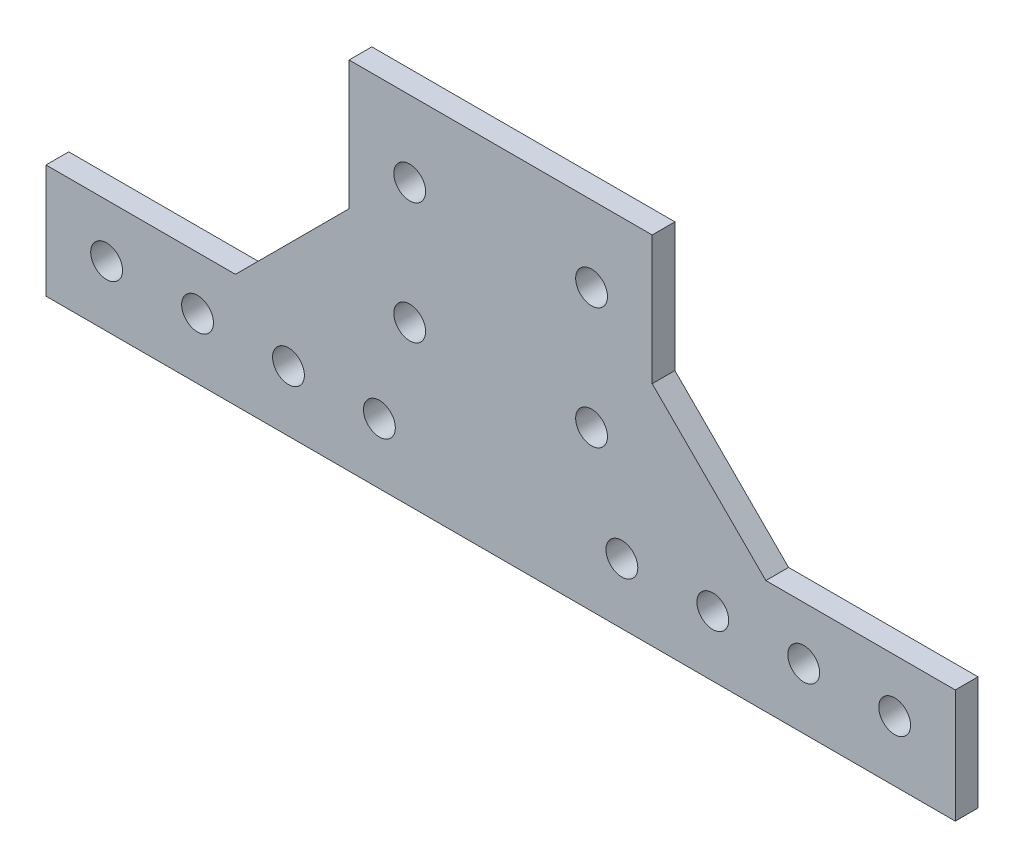
ISO-10303-21;
HEADER;
FILE_DESCRIPTION(('STEP AP214'),'2;1');
FILE_NAME('part.step','',(''),(''),'','','');
FILE_SCHEMA(('AUTOMOTIVE_DESIGN { 1 0 10303 214 1 1 1 1 }'));
ENDSEC;
DATA;
#1=APPLICATION_CONTEXT('core data for automotive mechanical design processes');
#2=APPLICATION_PROTOCOL_DEFINITION('international standard','automotive_design',2000,#1);
#3=PRODUCT_CONTEXT('',#1,'mechanical');
#4=PRODUCT('Part','Part','',(#3));
#5=PRODUCT_RELATED_PRODUCT_CATEGORY('part','',(#4));
#6=PRODUCT_DEFINITION_FORMATION('','',#4);
#7=PRODUCT_DEFINITION_CONTEXT('part definition',#1,'design');
#8=PRODUCT_DEFINITION('design','',#6,#7);
#9=PRODUCT_DEFINITION_SHAPE('','',#8);
#10=(LENGTH_UNIT() NAMED_UNIT(*) SI_UNIT(.MILLI.,.METRE.));
#11=(NAMED_UNIT(*) PLANE_ANGLE_UNIT() SI_UNIT($,.RADIAN.));
#12=(NAMED_UNIT(*) SI_UNIT($,.STERADIAN.) SOLID_ANGLE_UNIT());
#13=UNCERTAINTY_MEASURE_WITH_UNIT(LENGTH_MEASURE(1.E-05),#10,'distance_accuracy_value','');
#14=(GEOMETRIC_REPRESENTATION_CONTEXT(3) GLOBAL_UNCERTAINTY_ASSIGNED_CONTEXT((#13)) GLOBAL_UNIT_ASSIGNED_CONTEXT((#10,
#11,#12)) REPRESENTATION_CONTEXT('',''));
#15=CARTESIAN_POINT('',(0.,0.,0.));
#16=DIRECTION('',(0.,0.,1.));
#17=DIRECTION('',(1.,0.,0.));
#18=AXIS2_PLACEMENT_3D('',#15,#16,#17);
#19=CARTESIAN_POINT('',(120.,0.,3.));
#20=DIRECTION('',(0.,1.,0.));
#21=DIRECTION('',(-1.,0.,0.));
#22=AXIS2_PLACEMENT_3D('',#19,#20,#21);
#23=PLANE('',#22);
#24=DIRECTION('',(1.,0.,0.));
#25=VECTOR('',#24,1.);
#26=CARTESIAN_POINT('',(120.,0.,0.));
#27=LINE('',#26,#25);
#28=CARTESIAN_POINT('',(0.,0.,0.));
#29=VERTEX_POINT('',#28);
#30=CARTESIAN_POINT('',(120.,0.,0.));
#31=VERTEX_POINT('',#30);
#32=EDGE_CURVE('E143',#29,#31,#27,.T.);
#33=ORIENTED_EDGE('',*,*,#32,.T.);
#34=DIRECTION('',(0.,0.,-1.));
#35=VECTOR('',#34,1.);
#36=CARTESIAN_POINT('',(120.,0.,3.));
#37=LINE('',#36,#35);
#38=CARTESIAN_POINT('',(120.,0.,3.));
#39=VERTEX_POINT('',#38);
#40=EDGE_CURVE('E11',#39,#31,#37,.T.);
#41=ORIENTED_EDGE('',*,*,#40,.F.);
#42=DIRECTION('',(1.,0.,0.));
#43=VECTOR('',#42,1.);
#44=CARTESIAN_POINT('',(120.,0.,3.));
#45=LINE('',#44,#43);
#46=CARTESIAN_POINT('',(0.,0.,3.));
#47=VERTEX_POINT('',#46);
#48=EDGE_CURVE('E162',#47,#39,#45,.T.);
#49=ORIENTED_EDGE('',*,*,#48,.F.);
#50=DIRECTION('',(0.,0.,-1.));
#51=VECTOR('',#50,1.);
#52=CARTESIAN_POINT('',(0.,0.,3.));
#53=LINE('',#52,#51);
#54=EDGE_CURVE('E139',#47,#29,#53,.T.);
#55=ORIENTED_EDGE('',*,*,#54,.T.);
#56=EDGE_LOOP('',(#33,#41,#49,#55));
#57=FACE_BOUND('',#56,.T.);
#58=ADVANCED_FACE('F35',(#57),#23,.F.);
#59=CARTESIAN_POINT('',(120.,15.,3.));
#60=DIRECTION('',(-1.,0.,0.));
#61=DIRECTION('',(0.,-1.,0.));
#62=AXIS2_PLACEMENT_3D('',#59,#60,#61);
#63=PLANE('',#62);
#64=DIRECTION('',(0.,1.,0.));
#65=VECTOR('',#64,1.);
#66=CARTESIAN_POINT('',(120.,15.,0.));
#67=LINE('',#66,#65);
#68=CARTESIAN_POINT('',(120.,15.,0.));
#69=VERTEX_POINT('',#68);
#70=EDGE_CURVE('E146',#31,#69,#67,.T.);
#71=ORIENTED_EDGE('',*,*,#70,.T.);
#72=DIRECTION('',(0.,0.,-1.));
#73=VECTOR('',#72,1.);
#74=CARTESIAN_POINT('',(120.,15.,3.));
#75=LINE('',#74,#73);
#76=CARTESIAN_POINT('',(120.,15.,3.));
#77=VERTEX_POINT('',#76);
#78=EDGE_CURVE('E43',#77,#69,#75,.T.);
#79=ORIENTED_EDGE('',*,*,#78,.F.);
#80=DIRECTION('',(0.,1.,0.));
#81=VECTOR('',#80,1.);
#82=CARTESIAN_POINT('',(120.,15.,3.));
#83=LINE('',#82,#81);
#84=EDGE_CURVE('E100',#39,#77,#83,.T.);
#85=ORIENTED_EDGE('',*,*,#84,.F.);
#86=ORIENTED_EDGE('',*,*,#40,.T.);
#87=EDGE_LOOP('',(#71,#79,#85,#86));
#88=FACE_BOUND('',#87,.T.);
#89=ADVANCED_FACE('F331',(#88),#63,.F.);
#90=CARTESIAN_POINT('',(95.0000000000001,15.,3.));
#91=DIRECTION('',(0.,-1.,0.));
#92=DIRECTION('',(0.,0.,-1.));
#93=AXIS2_PLACEMENT_3D('',#90,#91,#92);
#94=PLANE('',#93);
#95=DIRECTION('',(-1.,0.,0.));
#96=VECTOR('',#95,1.);
#97=CARTESIAN_POINT('',(95.0000000000001,15.,0.));
#98=LINE('',#97,#96);
#99=CARTESIAN_POINT('',(95.0000000000001,15.,0.));
#100=VERTEX_POINT('',#99);
#101=EDGE_CURVE('E149',#69,#100,#98,.T.);
#102=ORIENTED_EDGE('',*,*,#101,.T.);
#103=DIRECTION('',(0.,0.,-1.));
#104=VECTOR('',#103,1.);
#105=CARTESIAN_POINT('',(95.0000000000001,15.,3.));
#106=LINE('',#105,#104);
#107=CARTESIAN_POINT('',(95.0000000000001,15.,3.));
#108=VERTEX_POINT('',#107);
#109=EDGE_CURVE('E175',#108,#100,#106,.T.);
#110=ORIENTED_EDGE('',*,*,#109,.F.);
#111=DIRECTION('',(-1.,0.,0.));
#112=VECTOR('',#111,1.);
#113=CARTESIAN_POINT('',(95.0000000000001,15.,3.));
#114=LINE('',#113,#112);
#115=EDGE_CURVE('E183',#77,#108,#114,.T.);
#116=ORIENTED_EDGE('',*,*,#115,.F.);
#117=ORIENTED_EDGE('',*,*,#78,.T.);
#118=EDGE_LOOP('',(#102,#110,#116,#117));
#119=FACE_BOUND('',#118,.T.);
#120=ADVANCED_FACE('F181',(#119),#94,.F.);
#121=CARTESIAN_POINT('',(80.,30.,3.));
#122=DIRECTION('',(-0.707106781186548,-0.707106781186547,0.));
#123=DIRECTION('',(0.707106781186547,-0.707106781186548,0.));
#124=AXIS2_PLACEMENT_3D('',#121,#122,#123);
#125=PLANE('',#124);
#126=DIRECTION('',(-0.707106781186547,0.707106781186548,0.));
#127=VECTOR('',#126,1.);
#128=CARTESIAN_POINT('',(80.,30.,0.));
#129=LINE('',#128,#127);
#130=CARTESIAN_POINT('',(80.,30.,0.));
#131=VERTEX_POINT('',#130);
#132=EDGE_CURVE('E151',#100,#131,#129,.T.);
#133=ORIENTED_EDGE('',*,*,#132,.T.);
#134=DIRECTION('',(0.,0.,-1.));
#135=VECTOR('',#134,1.);
#136=CARTESIAN_POINT('',(80.,30.,3.));
#137=LINE('',#136,#135);
#138=CARTESIAN_POINT('',(80.,30.,3.));
#139=VERTEX_POINT('',#138);
#140=EDGE_CURVE('E172',#139,#131,#137,.T.);
#141=ORIENTED_EDGE('',*,*,#140,.F.);
#142=DIRECTION('',(-0.707106781186547,0.707106781186548,0.));
#143=VECTOR('',#142,1.);
#144=CARTESIAN_POINT('',(80.,30.,3.));
#145=LINE('',#144,#143);
#146=EDGE_CURVE('E201',#108,#139,#145,.T.);
#147=ORIENTED_EDGE('',*,*,#146,.F.);
#148=ORIENTED_EDGE('',*,*,#109,.T.);
#149=EDGE_LOOP('',(#133,#141,#147,#148));
#150=FACE_BOUND('',#149,.T.);
#151=ADVANCED_FACE('F192',(#150),#125,.F.);
#152=CARTESIAN_POINT('',(80.,47.,3.));
#153=DIRECTION('',(-1.,0.,0.));
#154=DIRECTION('',(0.,0.,1.));
#155=AXIS2_PLACEMENT_3D('',#152,#153,#154);
#156=PLANE('',#155);
#157=DIRECTION('',(0.,1.,0.));
#158=VECTOR('',#157,1.);
#159=CARTESIAN_POINT('',(80.,47.,0.));
#160=LINE('',#159,#158);
#161=CARTESIAN_POINT('',(80.,47.,0.));
#162=VERTEX_POINT('',#161);
#163=EDGE_CURVE('E153',#131,#162,#160,.T.);
#164=ORIENTED_EDGE('',*,*,#163,.T.);
#165=DIRECTION('',(0.,0.,-1.));
#166=VECTOR('',#165,1.);
#167=CARTESIAN_POINT('',(80.,47.,3.));
#168=LINE('',#167,#166);
#169=CARTESIAN_POINT('',(80.,47.,3.));
#170=VERTEX_POINT('',#169);
#171=EDGE_CURVE('E169',#170,#162,#168,.T.);
#172=ORIENTED_EDGE('',*,*,#171,.F.);
#173=DIRECTION('',(0.,1.,0.));
#174=VECTOR('',#173,1.);
#175=CARTESIAN_POINT('',(80.,47.,3.));
#176=LINE('',#175,#174);
#177=EDGE_CURVE('E198',#139,#170,#176,.T.);
#178=ORIENTED_EDGE('',*,*,#177,.F.);
#179=ORIENTED_EDGE('',*,*,#140,.T.);
#180=EDGE_LOOP('',(#164,#172,#178,#179));
#181=FACE_BOUND('',#180,.T.);
#182=ADVANCED_FACE('F196',(#181),#156,.F.);
#183=CARTESIAN_POINT('',(40.,47.,3.));
#184=DIRECTION('',(0.,-1.,0.));
#185=DIRECTION('',(0.,0.,-1.));
#186=AXIS2_PLACEMENT_3D('',#183,#184,#185);
#187=PLANE('',#186);
#188=DIRECTION('',(-1.,0.,0.));
#189=VECTOR('',#188,1.);
#190=CARTESIAN_POINT('',(40.,47.,0.));
#191=LINE('',#190,#189);
#192=CARTESIAN_POINT('',(40.,47.,0.));
#193=VERTEX_POINT('',#192);
#194=EDGE_CURVE('E155',#162,#193,#191,.T.);
#195=ORIENTED_EDGE('',*,*,#194,.T.);
#196=DIRECTION('',(0.,0.,-1.));
#197=VECTOR('',#196,1.);
#198=CARTESIAN_POINT('',(40.,47.,3.));
#199=LINE('',#198,#197);
#200=CARTESIAN_POINT('',(40.,47.,3.));
#201=VERTEX_POINT('',#200);
#202=EDGE_CURVE('E166',#201,#193,#199,.T.);
#203=ORIENTED_EDGE('',*,*,#202,.F.);
#204=DIRECTION('',(-1.,0.,0.));
#205=VECTOR('',#204,1.);
#206=CARTESIAN_POINT('',(40.,47.,3.));
#207=LINE('',#206,#205);
#208=EDGE_CURVE('E200',#170,#201,#207,.T.);
#209=ORIENTED_EDGE('',*,*,#208,.F.);
#210=ORIENTED_EDGE('',*,*,#171,.T.);
#211=EDGE_LOOP('',(#195,#203,#209,#210));
#212=FACE_BOUND('',#211,.T.);
#213=ADVANCED_FACE('F343',(#212),#187,.F.);
#214=CARTESIAN_POINT('',(40.,30.,3.));
#215=DIRECTION('',(1.,0.,0.));
#216=DIRECTION('',(0.,1.,0.));
#217=AXIS2_PLACEMENT_3D('',#214,#215,#216);
#218=PLANE('',#217);
#219=DIRECTION('',(0.,-1.,0.));
#220=VECTOR('',#219,1.);
#221=CARTESIAN_POINT('',(40.,30.,0.));
#222=LINE('',#221,#220);
#223=CARTESIAN_POINT('',(40.,30.,0.));
#224=VERTEX_POINT('',#223);
#225=EDGE_CURVE('E157',#193,#224,#222,.T.);
#226=ORIENTED_EDGE('',*,*,#225,.T.);
#227=DIRECTION('',(0.,0.,-1.));
#228=VECTOR('',#227,1.);
#229=CARTESIAN_POINT('',(40.,30.,3.));
#230=LINE('',#229,#228);
#231=CARTESIAN_POINT('',(40.,30.,3.));
#232=VERTEX_POINT('',#231);
#233=EDGE_CURVE('E134',#232,#224,#230,.T.);
#234=ORIENTED_EDGE('',*,*,#233,.F.);
#235=DIRECTION('',(0.,-1.,0.));
#236=VECTOR('',#235,1.);
#237=CARTESIAN_POINT('',(40.,30.,3.));
#238=LINE('',#237,#236);
#239=EDGE_CURVE('E125',#201,#232,#238,.T.);
#240=ORIENTED_EDGE('',*,*,#239,.F.);
#241=ORIENTED_EDGE('',*,*,#202,.T.);
#242=EDGE_LOOP('',(#226,#234,#240,#241));
#243=FACE_BOUND('',#242,.T.);
#244=ADVANCED_FACE('F340',(#243),#218,.F.);
#245=CARTESIAN_POINT('',(25.,15.,3.));
#246=DIRECTION('',(0.707106781186549,-0.707106781186546,0.));
#247=DIRECTION('',(0.707106781186546,0.707106781186549,0.));
#248=AXIS2_PLACEMENT_3D('',#245,#246,#247);
#249=PLANE('',#248);
#250=DIRECTION('',(-0.707106781186546,-0.707106781186549,0.));
#251=VECTOR('',#250,1.);
#252=CARTESIAN_POINT('',(25.,15.,0.));
#253=LINE('',#252,#251);
#254=CARTESIAN_POINT('',(25.,15.,0.));
#255=VERTEX_POINT('',#254);
#256=EDGE_CURVE('E133',#224,#255,#253,.T.);
#257=ORIENTED_EDGE('',*,*,#256,.T.);
#258=DIRECTION('',(0.,0.,-1.));
#259=VECTOR('',#258,1.);
#260=CARTESIAN_POINT('',(25.,15.,3.));
#261=LINE('',#260,#259);
#262=CARTESIAN_POINT('',(25.,15.,3.));
#263=VERTEX_POINT('',#262);
#264=EDGE_CURVE('E130',#263,#255,#261,.T.);
#265=ORIENTED_EDGE('',*,*,#264,.F.);
#266=DIRECTION('',(-0.707106781186546,-0.707106781186549,0.));
#267=VECTOR('',#266,1.);
#268=CARTESIAN_POINT('',(25.,15.,3.));
#269=LINE('',#268,#267);
#270=EDGE_CURVE('E119',#232,#263,#269,.T.);
#271=ORIENTED_EDGE('',*,*,#270,.F.);
#272=ORIENTED_EDGE('',*,*,#233,.T.);
#273=EDGE_LOOP('',(#257,#265,#271,#272));
#274=FACE_BOUND('',#273,.T.);
#275=ADVANCED_FACE('F131',(#274),#249,.F.);
#276=CARTESIAN_POINT('',(0.,15.,3.));
#277=DIRECTION('',(0.,-1.,0.));
#278=DIRECTION('',(1.,0.,0.));
#279=AXIS2_PLACEMENT_3D('',#276,#277,#278);
#280=PLANE('',#279);
#281=DIRECTION('',(-1.,0.,0.));
#282=VECTOR('',#281,1.);
#283=CARTESIAN_POINT('',(0.,15.,0.));
#284=LINE('',#283,#282);
#285=CARTESIAN_POINT('',(0.,15.,0.));
#286=VERTEX_POINT('',#285);
#287=EDGE_CURVE('E86',#255,#286,#284,.T.);
#288=ORIENTED_EDGE('',*,*,#287,.T.);
#289=DIRECTION('',(0.,0.,-1.));
#290=VECTOR('',#289,1.);
#291=CARTESIAN_POINT('',(0.,15.,3.));
#292=LINE('',#291,#290);
#293=CARTESIAN_POINT('',(0.,15.,3.));
#294=VERTEX_POINT('',#293);
#295=EDGE_CURVE('E135',#294,#286,#292,.T.);
#296=ORIENTED_EDGE('',*,*,#295,.F.);
#297=DIRECTION('',(-1.,0.,0.));
#298=VECTOR('',#297,1.);
#299=CARTESIAN_POINT('',(0.,15.,3.));
#300=LINE('',#299,#298);
#301=EDGE_CURVE('E123',#263,#294,#300,.T.);
#302=ORIENTED_EDGE('',*,*,#301,.F.);
#303=ORIENTED_EDGE('',*,*,#264,.T.);
#304=EDGE_LOOP('',(#288,#296,#302,#303));
#305=FACE_BOUND('',#304,.T.);
#306=ADVANCED_FACE('F137',(#305),#280,.F.);
#307=CARTESIAN_POINT('',(0.,0.,3.));
#308=DIRECTION('',(1.,0.,0.));
#309=DIRECTION('',(0.,0.,-1.));
#310=AXIS2_PLACEMENT_3D('',#307,#308,#309);
#311=PLANE('',#310);
#312=DIRECTION('',(0.,-1.,0.));
#313=VECTOR('',#312,1.);
#314=CARTESIAN_POINT('',(0.,0.,0.));
#315=LINE('',#314,#313);
#316=EDGE_CURVE('E92',#286,#29,#315,.T.);
#317=ORIENTED_EDGE('',*,*,#316,.T.);
#318=ORIENTED_EDGE('',*,*,#54,.F.);
#319=DIRECTION('',(0.,-1.,0.));
#320=VECTOR('',#319,1.);
#321=CARTESIAN_POINT('',(0.,0.,3.));
#322=LINE('',#321,#320);
#323=EDGE_CURVE('E51',#294,#47,#322,.T.);
#324=ORIENTED_EDGE('',*,*,#323,.F.);
#325=ORIENTED_EDGE('',*,*,#295,.T.);
#326=EDGE_LOOP('',(#317,#318,#324,#325));
#327=FACE_BOUND('',#326,.T.);
#328=ADVANCED_FACE('F293',(#327),#311,.F.);
#329=CARTESIAN_POINT('',(0.,0.,3.));
#330=DIRECTION('',(0.,0.,-1.));
#331=DIRECTION('',(-1.,0.,0.));
#332=AXIS2_PLACEMENT_3D('',#329,#330,#331);
#333=PLANE('',#332);
#334=CARTESIAN_POINT('',(100.000000000147,7.99999999994358,3.));
#335=DIRECTION('',(0.,0.,1.));
#336=DIRECTION('',(1.,0.,0.));
#337=AXIS2_PLACEMENT_3D('',#334,#335,#336);
#338=CIRCLE('',#337,2.10000000007992);
#339=CARTESIAN_POINT('',(102.100000000227,7.99999999994358,3.));
#340=VERTEX_POINT('',#339);
#341=EDGE_CURVE('E270',#340,#340,#338,.T.);
#342=ORIENTED_EDGE('',*,*,#341,.F.);
#343=EDGE_LOOP('',(#342));
#344=FACE_BOUND('',#343,.T.);
#345=CARTESIAN_POINT('',(32.0000000001465,7.99999999994356,3.));
#346=DIRECTION('',(0.,0.,1.));
#347=DIRECTION('',(1.,0.,0.));
#348=AXIS2_PLACEMENT_3D('',#345,#346,#347);
#349=CIRCLE('',#348,2.10000000007993);
#350=CARTESIAN_POINT('',(34.1000000002265,7.99999999994356,3.));
#351=VERTEX_POINT('',#350);
#352=EDGE_CURVE('E263',#351,#351,#349,.T.);
#353=ORIENTED_EDGE('',*,*,#352,.F.);
#354=EDGE_LOOP('',(#353));
#355=FACE_BOUND('',#354,.T.);
#356=CARTESIAN_POINT('',(44.0000000001465,7.99999999994356,3.));
#357=DIRECTION('',(0.,0.,1.));
#358=DIRECTION('',(1.,0.,0.));
#359=AXIS2_PLACEMENT_3D('',#356,#357,#358);
#360=CIRCLE('',#359,2.10000000007998);
#361=CARTESIAN_POINT('',(46.1000000002265,7.99999999994356,3.));
#362=VERTEX_POINT('',#361);
#363=EDGE_CURVE('E275',#362,#362,#360,.T.);
#364=ORIENTED_EDGE('',*,*,#363,.F.);
#365=EDGE_LOOP('',(#364));
#366=FACE_BOUND('',#365,.T.);
#367=CARTESIAN_POINT('',(112.000000000147,7.99999999994358,3.));
#368=DIRECTION('',(0.,0.,1.));
#369=DIRECTION('',(1.,0.,0.));
#370=AXIS2_PLACEMENT_3D('',#367,#368,#369);
#371=CIRCLE('',#370,2.10000000008004);
#372=CARTESIAN_POINT('',(114.100000000227,7.99999999994358,3.));
#373=VERTEX_POINT('',#372);
#374=EDGE_CURVE('E227',#373,#373,#371,.T.);
#375=ORIENTED_EDGE('',*,*,#374,.F.);
#376=EDGE_LOOP('',(#375));
#377=FACE_BOUND('',#376,.T.);
#378=CARTESIAN_POINT('',(72.0000000001462,20.9999999999449,3.));
#379=DIRECTION('',(0.,0.,1.));
#380=DIRECTION('',(1.,0.,0.));
#381=AXIS2_PLACEMENT_3D('',#378,#379,#380);
#382=CIRCLE('',#381,2.0999999999237);
#383=CARTESIAN_POINT('',(74.1000000000699,20.9999999999449,3.));
#384=VERTEX_POINT('',#383);
#385=EDGE_CURVE('E234',#384,#384,#382,.T.);
#386=ORIENTED_EDGE('',*,*,#385,.F.);
#387=EDGE_LOOP('',(#386));
#388=FACE_BOUND('',#387,.T.);
#389=CARTESIAN_POINT('',(48.0000000001462,20.9999999999449,3.));
#390=DIRECTION('',(0.,0.,1.));
#391=DIRECTION('',(1.,0.,0.));
#392=AXIS2_PLACEMENT_3D('',#389,#390,#391);
#393=CIRCLE('',#392,2.0999999999237);
#394=CARTESIAN_POINT('',(50.1000000000699,20.9999999999449,3.));
#395=VERTEX_POINT('',#394);
#396=EDGE_CURVE('E215',#395,#395,#393,.T.);
#397=ORIENTED_EDGE('',*,*,#396,.F.);
#398=EDGE_LOOP('',(#397));
#399=FACE_BOUND('',#398,.T.);
#400=CARTESIAN_POINT('',(72.0000000001462,36.9999999999449,3.));
#401=DIRECTION('',(0.,0.,1.));
#402=DIRECTION('',(1.,0.,0.));
#403=AXIS2_PLACEMENT_3D('',#400,#401,#402);
#404=CIRCLE('',#403,2.0999999999237);
#405=CARTESIAN_POINT('',(74.1000000000699,36.9999999999449,3.));
#406=VERTEX_POINT('',#405);
#407=EDGE_CURVE('E222',#406,#406,#404,.T.);
#408=ORIENTED_EDGE('',*,*,#407,.F.);
#409=EDGE_LOOP('',(#408));
#410=FACE_BOUND('',#409,.T.);
#411=CARTESIAN_POINT('',(76.0000000001466,7.99999999994357,3.));
#412=DIRECTION('',(0.,0.,1.));
#413=DIRECTION('',(1.,0.,0.));
#414=AXIS2_PLACEMENT_3D('',#411,#412,#413);
#415=CIRCLE('',#414,2.10000000007992);
#416=CARTESIAN_POINT('',(78.1000000002265,7.99999999994357,3.));
#417=VERTEX_POINT('',#416);
#418=EDGE_CURVE('E258',#417,#417,#415,.T.);
#419=ORIENTED_EDGE('',*,*,#418,.F.);
#420=EDGE_LOOP('',(#419));
#421=FACE_BOUND('',#420,.T.);
#422=CARTESIAN_POINT('',(88.0000000001466,7.99999999994357,3.));
#423=DIRECTION('',(0.,0.,1.));
#424=DIRECTION('',(1.,0.,0.));
#425=AXIS2_PLACEMENT_3D('',#422,#423,#424);
#426=CIRCLE('',#425,2.10000000007992);
#427=CARTESIAN_POINT('',(90.1000000002266,7.99999999994357,3.));
#428=VERTEX_POINT('',#427);
#429=EDGE_CURVE('E252',#428,#428,#426,.T.);
#430=ORIENTED_EDGE('',*,*,#429,.F.);
#431=EDGE_LOOP('',(#430));
#432=FACE_BOUND('',#431,.T.);
#433=CARTESIAN_POINT('',(8.0000000001465,7.99999999994355,3.));
#434=DIRECTION('',(0.,0.,1.));
#435=DIRECTION('',(1.,0.,0.));
#436=AXIS2_PLACEMENT_3D('',#433,#434,#435);
#437=CIRCLE('',#436,2.10000000007993);
#438=CARTESIAN_POINT('',(10.1000000002264,7.99999999994355,3.));
#439=VERTEX_POINT('',#438);
#440=EDGE_CURVE('E246',#439,#439,#437,.T.);
#441=ORIENTED_EDGE('',*,*,#440,.F.);
#442=EDGE_LOOP('',(#441));
#443=FACE_BOUND('',#442,.T.);
#444=CARTESIAN_POINT('',(20.0000000001465,7.99999999994355,3.));
#445=DIRECTION('',(0.,0.,1.));
#446=DIRECTION('',(1.,0.,0.));
#447=AXIS2_PLACEMENT_3D('',#444,#445,#446);
#448=CIRCLE('',#447,2.10000000007993);
#449=CARTESIAN_POINT('',(22.1000000002264,7.99999999994355,3.));
#450=VERTEX_POINT('',#449);
#451=EDGE_CURVE('E239',#450,#450,#448,.T.);
#452=ORIENTED_EDGE('',*,*,#451,.F.);
#453=EDGE_LOOP('',(#452));
#454=FACE_BOUND('',#453,.T.);
#455=CARTESIAN_POINT('',(48.0000000001462,36.9999999999449,3.));
#456=DIRECTION('',(0.,0.,1.));
#457=DIRECTION('',(1.,0.,0.));
#458=AXIS2_PLACEMENT_3D('',#455,#456,#457);
#459=CIRCLE('',#458,2.0999999999237);
#460=CARTESIAN_POINT('',(50.1000000000699,36.9999999999449,3.));
#461=VERTEX_POINT('',#460);
#462=EDGE_CURVE('E209',#461,#461,#459,.T.);
#463=ORIENTED_EDGE('',*,*,#462,.F.);
#464=EDGE_LOOP('',(#463));
#465=FACE_BOUND('',#464,.T.);
#466=ORIENTED_EDGE('',*,*,#48,.T.);
#467=ORIENTED_EDGE('',*,*,#84,.T.);
#468=ORIENTED_EDGE('',*,*,#115,.T.);
#469=ORIENTED_EDGE('',*,*,#146,.T.);
#470=ORIENTED_EDGE('',*,*,#177,.T.);
#471=ORIENTED_EDGE('',*,*,#208,.T.);
#472=ORIENTED_EDGE('',*,*,#239,.T.);
#473=ORIENTED_EDGE('',*,*,#270,.T.);
#474=ORIENTED_EDGE('',*,*,#301,.T.);
#475=ORIENTED_EDGE('',*,*,#323,.T.);
#476=EDGE_LOOP('',(#466,#467,#468,#469,#470,#471,#472,#473,#474,#475));
#477=FACE_BOUND('',#476,.T.);
#478=ADVANCED_FACE('F121',(#344,#355,#366,#377,#388,#399,#410,#421,#432,#443,#454,#465,#477),
#333,.F.);
#479=CARTESIAN_POINT('',(0.,0.,0.));
#480=DIRECTION('',(0.,0.,-1.));
#481=DIRECTION('',(-1.,0.,0.));
#482=AXIS2_PLACEMENT_3D('',#479,#480,#481);
#483=PLANE('',#482);
#484=CARTESIAN_POINT('',(100.000000000147,7.99999999994358,0.));
#485=DIRECTION('',(0.,0.,1.));
#486=DIRECTION('',(1.,0.,0.));
#487=AXIS2_PLACEMENT_3D('',#484,#485,#486);
#488=CIRCLE('',#487,2.10000000007992);
#489=CARTESIAN_POINT('',(102.100000000227,7.99999999994358,0.));
#490=VERTEX_POINT('',#489);
#491=EDGE_CURVE('E243',#490,#490,#488,.T.);
#492=ORIENTED_EDGE('',*,*,#491,.T.);
#493=EDGE_LOOP('',(#492));
#494=FACE_BOUND('',#493,.T.);
#495=CARTESIAN_POINT('',(32.0000000001465,7.99999999994356,0.));
#496=DIRECTION('',(0.,0.,1.));
#497=DIRECTION('',(1.,0.,0.));
#498=AXIS2_PLACEMENT_3D('',#495,#496,#497);
#499=CIRCLE('',#498,2.10000000007993);
#500=CARTESIAN_POINT('',(34.1000000002265,7.99999999994356,0.));
#501=VERTEX_POINT('',#500);
#502=EDGE_CURVE('E266',#501,#501,#499,.T.);
#503=ORIENTED_EDGE('',*,*,#502,.T.);
#504=EDGE_LOOP('',(#503));
#505=FACE_BOUND('',#504,.T.);
#506=CARTESIAN_POINT('',(44.0000000001465,7.99999999994356,0.));
#507=DIRECTION('',(0.,0.,1.));
#508=DIRECTION('',(1.,0.,0.));
#509=AXIS2_PLACEMENT_3D('',#506,#507,#508);
#510=CIRCLE('',#509,2.10000000007998);
#511=CARTESIAN_POINT('',(46.1000000002265,7.99999999994356,0.));
#512=VERTEX_POINT('',#511);
#513=EDGE_CURVE('E267',#512,#512,#510,.T.);
#514=ORIENTED_EDGE('',*,*,#513,.T.);
#515=EDGE_LOOP('',(#514));
#516=FACE_BOUND('',#515,.T.);
#517=CARTESIAN_POINT('',(112.000000000147,7.99999999994358,0.));
#518=DIRECTION('',(0.,0.,1.));
#519=DIRECTION('',(1.,0.,0.));
#520=AXIS2_PLACEMENT_3D('',#517,#518,#519);
#521=CIRCLE('',#520,2.10000000008004);
#522=CARTESIAN_POINT('',(114.100000000227,7.99999999994358,0.));
#523=VERTEX_POINT('',#522);
#524=EDGE_CURVE('E230',#523,#523,#521,.T.);
#525=ORIENTED_EDGE('',*,*,#524,.T.);
#526=EDGE_LOOP('',(#525));
#527=FACE_BOUND('',#526,.T.);
#528=CARTESIAN_POINT('',(72.0000000001462,20.9999999999449,0.));
#529=DIRECTION('',(0.,0.,1.));
#530=DIRECTION('',(1.,0.,0.));
#531=AXIS2_PLACEMENT_3D('',#528,#529,#530);
#532=CIRCLE('',#531,2.0999999999237);
#533=CARTESIAN_POINT('',(74.1000000000699,20.9999999999449,0.));
#534=VERTEX_POINT('',#533);
#535=EDGE_CURVE('E219',#534,#534,#532,.T.);
#536=ORIENTED_EDGE('',*,*,#535,.T.);
#537=EDGE_LOOP('',(#536));
#538=FACE_BOUND('',#537,.T.);
#539=CARTESIAN_POINT('',(48.0000000001462,20.9999999999449,0.));
#540=DIRECTION('',(0.,0.,1.));
#541=DIRECTION('',(1.,0.,0.));
#542=AXIS2_PLACEMENT_3D('',#539,#540,#541);
#543=CIRCLE('',#542,2.0999999999237);
#544=CARTESIAN_POINT('',(50.1000000000699,20.9999999999449,0.));
#545=VERTEX_POINT('',#544);
#546=EDGE_CURVE('E218',#545,#545,#543,.T.);
#547=ORIENTED_EDGE('',*,*,#546,.T.);
#548=EDGE_LOOP('',(#547));
#549=FACE_BOUND('',#548,.T.);
#550=CARTESIAN_POINT('',(72.0000000001462,36.9999999999449,0.));
#551=DIRECTION('',(0.,0.,1.));
#552=DIRECTION('',(1.,0.,0.));
#553=AXIS2_PLACEMENT_3D('',#550,#551,#552);
#554=CIRCLE('',#553,2.0999999999237);
#555=CARTESIAN_POINT('',(74.1000000000699,36.9999999999449,0.));
#556=VERTEX_POINT('',#555);
#557=EDGE_CURVE('E212',#556,#556,#554,.T.);
#558=ORIENTED_EDGE('',*,*,#557,.T.);
#559=EDGE_LOOP('',(#558));
#560=FACE_BOUND('',#559,.T.);
#561=CARTESIAN_POINT('',(76.0000000001466,7.99999999994357,0.));
#562=DIRECTION('',(0.,0.,1.));
#563=DIRECTION('',(1.,0.,0.));
#564=AXIS2_PLACEMENT_3D('',#561,#562,#563);
#565=CIRCLE('',#564,2.10000000007992);
#566=CARTESIAN_POINT('',(78.1000000002265,7.99999999994357,0.));
#567=VERTEX_POINT('',#566);
#568=EDGE_CURVE('E231',#567,#567,#565,.T.);
#569=ORIENTED_EDGE('',*,*,#568,.T.);
#570=EDGE_LOOP('',(#569));
#571=FACE_BOUND('',#570,.T.);
#572=CARTESIAN_POINT('',(88.0000000001466,7.99999999994357,0.));
#573=DIRECTION('',(0.,0.,1.));
#574=DIRECTION('',(1.,0.,0.));
#575=AXIS2_PLACEMENT_3D('',#572,#573,#574);
#576=CIRCLE('',#575,2.10000000007992);
#577=CARTESIAN_POINT('',(90.1000000002266,7.99999999994357,0.));
#578=VERTEX_POINT('',#577);
#579=EDGE_CURVE('E255',#578,#578,#576,.T.);
#580=ORIENTED_EDGE('',*,*,#579,.T.);
#581=EDGE_LOOP('',(#580));
#582=FACE_BOUND('',#581,.T.);
#583=CARTESIAN_POINT('',(8.0000000001465,7.99999999994355,0.));
#584=DIRECTION('',(0.,0.,1.));
#585=DIRECTION('',(1.,0.,0.));
#586=AXIS2_PLACEMENT_3D('',#583,#584,#585);
#587=CIRCLE('',#586,2.10000000007993);
#588=CARTESIAN_POINT('',(10.1000000002264,7.99999999994355,0.));
#589=VERTEX_POINT('',#588);
#590=EDGE_CURVE('E249',#589,#589,#587,.T.);
#591=ORIENTED_EDGE('',*,*,#590,.T.);
#592=EDGE_LOOP('',(#591));
#593=FACE_BOUND('',#592,.T.);
#594=CARTESIAN_POINT('',(20.0000000001465,7.99999999994355,0.));
#595=DIRECTION('',(0.,0.,1.));
#596=DIRECTION('',(1.,0.,0.));
#597=AXIS2_PLACEMENT_3D('',#594,#595,#596);
#598=CIRCLE('',#597,2.10000000007993);
#599=CARTESIAN_POINT('',(22.1000000002264,7.99999999994355,0.));
#600=VERTEX_POINT('',#599);
#601=EDGE_CURVE('E242',#600,#600,#598,.T.);
#602=ORIENTED_EDGE('',*,*,#601,.T.);
#603=EDGE_LOOP('',(#602));
#604=FACE_BOUND('',#603,.T.);
#605=CARTESIAN_POINT('',(48.0000000001462,36.9999999999449,0.));
#606=DIRECTION('',(0.,0.,1.));
#607=DIRECTION('',(1.,0.,0.));
#608=AXIS2_PLACEMENT_3D('',#605,#606,#607);
#609=CIRCLE('',#608,2.0999999999237);
#610=CARTESIAN_POINT('',(50.1000000000699,36.9999999999449,0.));
#611=VERTEX_POINT('',#610);
#612=EDGE_CURVE('E147',#611,#611,#609,.T.);
#613=ORIENTED_EDGE('',*,*,#612,.T.);
#614=EDGE_LOOP('',(#613));
#615=FACE_BOUND('',#614,.T.);
#616=ORIENTED_EDGE('',*,*,#32,.F.);
#617=ORIENTED_EDGE('',*,*,#316,.F.);
#618=ORIENTED_EDGE('',*,*,#287,.F.);
#619=ORIENTED_EDGE('',*,*,#256,.F.);
#620=ORIENTED_EDGE('',*,*,#225,.F.);
#621=ORIENTED_EDGE('',*,*,#194,.F.);
#622=ORIENTED_EDGE('',*,*,#163,.F.);
#623=ORIENTED_EDGE('',*,*,#132,.F.);
#624=ORIENTED_EDGE('',*,*,#101,.F.);
#625=ORIENTED_EDGE('',*,*,#70,.F.);
#626=EDGE_LOOP('',(#616,#617,#618,#619,#620,#621,#622,#623,#624,#625));
#627=FACE_BOUND('',#626,.T.);
#628=ADVANCED_FACE('F187',(#494,#505,#516,#527,#538,#549,#560,#571,#582,#593,#604,#615,#627),
#483,.T.);
#629=CARTESIAN_POINT('',(48.0000000001462,36.9999999999449,0.));
#630=DIRECTION('',(0.,0.,1.));
#631=DIRECTION('',(1.,0.,0.));
#632=AXIS2_PLACEMENT_3D('',#629,#630,#631);
#633=CYLINDRICAL_SURFACE('',#632,2.0999999999237);
#634=ORIENTED_EDGE('',*,*,#612,.F.);
#635=EDGE_LOOP('',(#634));
#636=FACE_BOUND('',#635,.T.);
#637=ORIENTED_EDGE('',*,*,#462,.T.);
#638=EDGE_LOOP('',(#637));
#639=FACE_BOUND('',#638,.T.);
#640=ADVANCED_FACE('F314',(#636,#639),#633,.F.);
#641=CARTESIAN_POINT('',(20.0000000001465,7.99999999994355,0.));
#642=DIRECTION('',(0.,0.,1.));
#643=DIRECTION('',(1.,0.,0.));
#644=AXIS2_PLACEMENT_3D('',#641,#642,#643);
#645=CYLINDRICAL_SURFACE('',#644,2.10000000007993);
#646=ORIENTED_EDGE('',*,*,#601,.F.);
#647=EDGE_LOOP('',(#646));
#648=FACE_BOUND('',#647,.T.);
#649=ORIENTED_EDGE('',*,*,#451,.T.);
#650=EDGE_LOOP('',(#649));
#651=FACE_BOUND('',#650,.T.);
#652=ADVANCED_FACE('F316',(#648,#651),#645,.F.);
#653=CARTESIAN_POINT('',(8.0000000001465,7.99999999994355,0.));
#654=DIRECTION('',(0.,0.,1.));
#655=DIRECTION('',(1.,0.,0.));
#656=AXIS2_PLACEMENT_3D('',#653,#654,#655);
#657=CYLINDRICAL_SURFACE('',#656,2.10000000007993);
#658=ORIENTED_EDGE('',*,*,#590,.F.);
#659=EDGE_LOOP('',(#658));
#660=FACE_BOUND('',#659,.T.);
#661=ORIENTED_EDGE('',*,*,#440,.T.);
#662=EDGE_LOOP('',(#661));
#663=FACE_BOUND('',#662,.T.);
#664=ADVANCED_FACE('F323',(#660,#663),#657,.F.);
#665=CARTESIAN_POINT('',(88.0000000001466,7.99999999994357,0.));
#666=DIRECTION('',(0.,0.,1.));
#667=DIRECTION('',(1.,0.,0.));
#668=AXIS2_PLACEMENT_3D('',#665,#666,#667);
#669=CYLINDRICAL_SURFACE('',#668,2.10000000007992);
#670=ORIENTED_EDGE('',*,*,#579,.F.);
#671=EDGE_LOOP('',(#670));
#672=FACE_BOUND('',#671,.T.);
#673=ORIENTED_EDGE('',*,*,#429,.T.);
#674=EDGE_LOOP('',(#673));
#675=FACE_BOUND('',#674,.T.);
#676=ADVANCED_FACE('F433',(#672,#675),#669,.F.);
#677=CARTESIAN_POINT('',(76.0000000001466,7.99999999994357,0.));
#678=DIRECTION('',(0.,0.,1.));
#679=DIRECTION('',(1.,0.,0.));
#680=AXIS2_PLACEMENT_3D('',#677,#678,#679);
#681=CYLINDRICAL_SURFACE('',#680,2.10000000007992);
#682=ORIENTED_EDGE('',*,*,#568,.F.);
#683=EDGE_LOOP('',(#682));
#684=FACE_BOUND('',#683,.T.);
#685=ORIENTED_EDGE('',*,*,#418,.T.);
#686=EDGE_LOOP('',(#685));
#687=FACE_BOUND('',#686,.T.);
#688=ADVANCED_FACE('F443',(#684,#687),#681,.F.);
#689=CARTESIAN_POINT('',(72.0000000001462,36.9999999999449,0.));
#690=DIRECTION('',(0.,0.,1.));
#691=DIRECTION('',(1.,0.,0.));
#692=AXIS2_PLACEMENT_3D('',#689,#690,#691);
#693=CYLINDRICAL_SURFACE('',#692,2.0999999999237);
#694=ORIENTED_EDGE('',*,*,#557,.F.);
#695=EDGE_LOOP('',(#694));
#696=FACE_BOUND('',#695,.T.);
#697=ORIENTED_EDGE('',*,*,#407,.T.);
#698=EDGE_LOOP('',(#697));
#699=FACE_BOUND('',#698,.T.);
#700=ADVANCED_FACE('F453',(#696,#699),#693,.F.);
#701=CARTESIAN_POINT('',(48.0000000001462,20.9999999999449,0.));
#702=DIRECTION('',(0.,0.,1.));
#703=DIRECTION('',(1.,0.,0.));
#704=AXIS2_PLACEMENT_3D('',#701,#702,#703);
#705=CYLINDRICAL_SURFACE('',#704,2.0999999999237);
#706=ORIENTED_EDGE('',*,*,#546,.F.);
#707=EDGE_LOOP('',(#706));
#708=FACE_BOUND('',#707,.T.);
#709=ORIENTED_EDGE('',*,*,#396,.T.);
#710=EDGE_LOOP('',(#709));
#711=FACE_BOUND('',#710,.T.);
#712=ADVANCED_FACE('F463',(#708,#711),#705,.F.);
#713=CARTESIAN_POINT('',(72.0000000001462,20.9999999999449,0.));
#714=DIRECTION('',(0.,0.,1.));
#715=DIRECTION('',(1.,0.,0.));
#716=AXIS2_PLACEMENT_3D('',#713,#714,#715);
#717=CYLINDRICAL_SURFACE('',#716,2.0999999999237);
#718=ORIENTED_EDGE('',*,*,#535,.F.);
#719=EDGE_LOOP('',(#718));
#720=FACE_BOUND('',#719,.T.);
#721=ORIENTED_EDGE('',*,*,#385,.T.);
#722=EDGE_LOOP('',(#721));
#723=FACE_BOUND('',#722,.T.);
#724=ADVANCED_FACE('F473',(#720,#723),#717,.F.);
#725=CARTESIAN_POINT('',(112.000000000147,7.99999999994358,0.));
#726=DIRECTION('',(0.,0.,1.));
#727=DIRECTION('',(1.,0.,0.));
#728=AXIS2_PLACEMENT_3D('',#725,#726,#727);
#729=CYLINDRICAL_SURFACE('',#728,2.10000000008004);
#730=ORIENTED_EDGE('',*,*,#524,.F.);
#731=EDGE_LOOP('',(#730));
#732=FACE_BOUND('',#731,.T.);
#733=ORIENTED_EDGE('',*,*,#374,.T.);
#734=EDGE_LOOP('',(#733));
#735=FACE_BOUND('',#734,.T.);
#736=ADVANCED_FACE('F287',(#732,#735),#729,.F.);
#737=CARTESIAN_POINT('',(44.0000000001465,7.99999999994356,0.));
#738=DIRECTION('',(0.,0.,1.));
#739=DIRECTION('',(1.,0.,0.));
#740=AXIS2_PLACEMENT_3D('',#737,#738,#739);
#741=CYLINDRICAL_SURFACE('',#740,2.10000000007998);
#742=ORIENTED_EDGE('',*,*,#513,.F.);
#743=EDGE_LOOP('',(#742));
#744=FACE_BOUND('',#743,.T.);
#745=ORIENTED_EDGE('',*,*,#363,.T.);
#746=EDGE_LOOP('',(#745));
#747=FACE_BOUND('',#746,.T.);
#748=ADVANCED_FACE('F283',(#744,#747),#741,.F.);
#749=CARTESIAN_POINT('',(32.0000000001465,7.99999999994356,0.));
#750=DIRECTION('',(0.,0.,1.));
#751=DIRECTION('',(1.,0.,0.));
#752=AXIS2_PLACEMENT_3D('',#749,#750,#751);
#753=CYLINDRICAL_SURFACE('',#752,2.10000000007993);
#754=ORIENTED_EDGE('',*,*,#502,.F.);
#755=EDGE_LOOP('',(#754));
#756=FACE_BOUND('',#755,.T.);
#757=ORIENTED_EDGE('',*,*,#352,.T.);
#758=EDGE_LOOP('',(#757));
#759=FACE_BOUND('',#758,.T.);
#760=ADVANCED_FACE('F286',(#756,#759),#753,.F.);
#761=CARTESIAN_POINT('',(100.000000000147,7.99999999994358,0.));
#762=DIRECTION('',(0.,0.,1.));
#763=DIRECTION('',(1.,0.,0.));
#764=AXIS2_PLACEMENT_3D('',#761,#762,#763);
#765=CYLINDRICAL_SURFACE('',#764,2.10000000007992);
#766=ORIENTED_EDGE('',*,*,#491,.F.);
#767=EDGE_LOOP('',(#766));
#768=FACE_BOUND('',#767,.T.);
#769=ORIENTED_EDGE('',*,*,#341,.T.);
#770=EDGE_LOOP('',(#769));
#771=FACE_BOUND('',#770,.T.);
#772=ADVANCED_FACE('F506',(#768,#771),#765,.F.);
#773=CLOSED_SHELL('',(#58,#89,#120,#151,#182,#213,#244,#275,#306,#328,#478,#628,#640,#652,#664,
#676,#688,#700,#712,#724,#736,#748,#760,#772));
#774=MANIFOLD_SOLID_BREP('B2',#773);
#775=ADVANCED_BREP_SHAPE_REPRESENTATION('',(#18,#774),#14);
#776=SHAPE_DEFINITION_REPRESENTATION(#9,#775);
ENDSEC;
END-ISO-10303-21;
